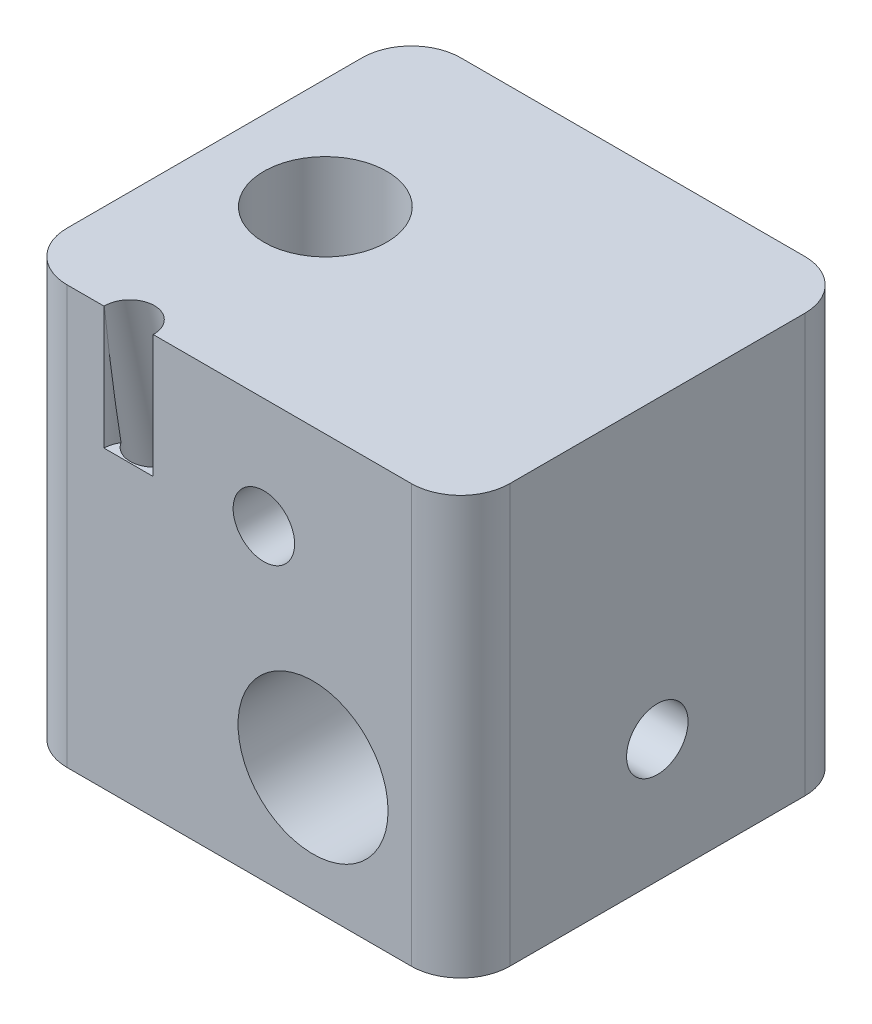
ISO-10303-21;
HEADER;
FILE_DESCRIPTION(('STEP AP214'),'2;1');
FILE_NAME('part.step','',(''),(''),'','','');
FILE_SCHEMA(('AUTOMOTIVE_DESIGN { 1 0 10303 214 1 1 1 1 }'));
ENDSEC;
DATA;
#1=APPLICATION_CONTEXT('core data for automotive mechanical design processes');
#2=APPLICATION_PROTOCOL_DEFINITION('international standard','automotive_design',2000,#1);
#3=PRODUCT_CONTEXT('',#1,'mechanical');
#4=PRODUCT('Part','Part','',(#3));
#5=PRODUCT_RELATED_PRODUCT_CATEGORY('part','',(#4));
#6=PRODUCT_DEFINITION_FORMATION('','',#4);
#7=PRODUCT_DEFINITION_CONTEXT('part definition',#1,'design');
#8=PRODUCT_DEFINITION('design','',#6,#7);
#9=PRODUCT_DEFINITION_SHAPE('','',#8);
#10=(LENGTH_UNIT() NAMED_UNIT(*) SI_UNIT(.MILLI.,.METRE.));
#11=(NAMED_UNIT(*) PLANE_ANGLE_UNIT() SI_UNIT($,.RADIAN.));
#12=(NAMED_UNIT(*) SI_UNIT($,.STERADIAN.) SOLID_ANGLE_UNIT());
#13=UNCERTAINTY_MEASURE_WITH_UNIT(LENGTH_MEASURE(1.E-05),#10,'distance_accuracy_value','');
#14=(GEOMETRIC_REPRESENTATION_CONTEXT(3) GLOBAL_UNCERTAINTY_ASSIGNED_CONTEXT((#13)) GLOBAL_UNIT_ASSIGNED_CONTEXT((#10,
#11,#12)) REPRESENTATION_CONTEXT('',''));
#15=CARTESIAN_POINT('',(0.,0.,0.));
#16=DIRECTION('',(0.,0.,1.));
#17=DIRECTION('',(1.,0.,0.));
#18=AXIS2_PLACEMENT_3D('',#15,#16,#17);
#19=CARTESIAN_POINT('',(-4.5,12.,8.));
#20=DIRECTION('',(0.,1.,0.));
#21=DIRECTION('',(0.,0.,1.));
#22=AXIS2_PLACEMENT_3D('',#19,#20,#21);
#23=CYLINDRICAL_SURFACE('',#22,1.);
#24=CARTESIAN_POINT('',(-4.5,17.,8.));
#25=DIRECTION('',(0.,1.,0.));
#26=DIRECTION('',(0.,0.,1.));
#27=AXIS2_PLACEMENT_3D('',#24,#25,#26);
#28=CIRCLE('',#27,1.);
#29=CARTESIAN_POINT('',(-3.5,17.,8.));
#30=VERTEX_POINT('',#29);
#31=CARTESIAN_POINT('',(-3.5000546384073,17.,7.98954658766438));
#32=VERTEX_POINT('',#31);
#33=EDGE_CURVE('E177',#30,#32,#28,.T.);
#34=ORIENTED_EDGE('',*,*,#33,.T.);
#35=CARTESIAN_POINT('',(-4.5,17.099457574649,8.00000000000001));
#36=DIRECTION('',(0.,0.104528463267653,-0.994521895368273));
#37=DIRECTION('',(0.,0.994521895368273,0.104528463267654));
#38=AXIS2_PLACEMENT_3D('',#35,#36,#37);
#39=ELLIPSE('',#38,9.56677223350565,1.);
#40=CARTESIAN_POINT('',(-3.65576588536236,12.,7.46402541134677));
#41=VERTEX_POINT('',#40);
#42=EDGE_CURVE('E11',#32,#41,#39,.T.);
#43=ORIENTED_EDGE('',*,*,#42,.T.);
#44=CARTESIAN_POINT('',(-4.5,12.,8.));
#45=DIRECTION('',(0.,1.,0.));
#46=DIRECTION('',(0.,0.,1.));
#47=AXIS2_PLACEMENT_3D('',#44,#45,#46);
#48=CIRCLE('',#47,1.);
#49=CARTESIAN_POINT('',(-3.5,12.,8.));
#50=VERTEX_POINT('',#49);
#51=EDGE_CURVE('E176',#50,#41,#48,.T.);
#52=ORIENTED_EDGE('',*,*,#51,.F.);
#53=DIRECTION('',(0.,1.,0.));
#54=VECTOR('',#53,1.);
#55=CARTESIAN_POINT('',(-3.5,12.,8.));
#56=LINE('',#55,#54);
#57=EDGE_CURVE('E66',#30,#50,#56,.F.);
#58=ORIENTED_EDGE('',*,*,#57,.F.);
#59=EDGE_LOOP('',(#34,#43,#52,#58));
#60=FACE_BOUND('',#59,.T.);
#61=ADVANCED_FACE('F38',(#60),#23,.F.);
#62=CARTESIAN_POINT('',(7.,0.,-6.));
#63=DIRECTION('',(0.,-1.,0.));
#64=DIRECTION('',(0.,0.,-1.));
#65=AXIS2_PLACEMENT_3D('',#62,#63,#64);
#66=PLANE('',#65);
#67=CARTESIAN_POINT('',(7.,0.,-6.));
#68=DIRECTION('',(0.,1.,0.));
#69=DIRECTION('',(0.,0.,-1.));
#70=AXIS2_PLACEMENT_3D('',#67,#68,#69);
#71=CIRCLE('',#70,2.);
#72=CARTESIAN_POINT('',(9.,0.,-5.99999999999998));
#73=VERTEX_POINT('',#72);
#74=CARTESIAN_POINT('',(6.99999999999998,0.,-8.));
#75=VERTEX_POINT('',#74);
#76=EDGE_CURVE('E203',#73,#75,#71,.T.);
#77=ORIENTED_EDGE('',*,*,#76,.F.);
#78=DIRECTION('',(0.,0.,-1.));
#79=VECTOR('',#78,1.);
#80=CARTESIAN_POINT('',(9.,0.,-5.99999999999998));
#81=LINE('',#80,#79);
#82=CARTESIAN_POINT('',(9.,0.,5.99999999999999));
#83=VERTEX_POINT('',#82);
#84=EDGE_CURVE('E210',#83,#73,#81,.T.);
#85=ORIENTED_EDGE('',*,*,#84,.F.);
#86=CARTESIAN_POINT('',(7.,0.,6.));
#87=DIRECTION('',(0.,1.,0.));
#88=DIRECTION('',(0.,0.,1.));
#89=AXIS2_PLACEMENT_3D('',#86,#87,#88);
#90=CIRCLE('',#89,2.);
#91=CARTESIAN_POINT('',(6.99999999999999,0.,8.));
#92=VERTEX_POINT('',#91);
#93=EDGE_CURVE('E239',#92,#83,#90,.T.);
#94=ORIENTED_EDGE('',*,*,#93,.F.);
#95=DIRECTION('',(1.,0.,0.));
#96=VECTOR('',#95,1.);
#97=CARTESIAN_POINT('',(-6.99999999999999,0.,8.));
#98=LINE('',#97,#96);
#99=CARTESIAN_POINT('',(-6.99999999999999,0.,8.));
#100=VERTEX_POINT('',#99);
#101=EDGE_CURVE('E237',#100,#92,#98,.T.);
#102=ORIENTED_EDGE('',*,*,#101,.F.);
#103=CARTESIAN_POINT('',(-7.,0.,6.));
#104=DIRECTION('',(0.,1.,0.));
#105=DIRECTION('',(0.,0.,1.));
#106=AXIS2_PLACEMENT_3D('',#103,#104,#105);
#107=CIRCLE('',#106,2.);
#108=CARTESIAN_POINT('',(-9.,0.,5.99999999999999));
#109=VERTEX_POINT('',#108);
#110=EDGE_CURVE('E235',#109,#100,#107,.T.);
#111=ORIENTED_EDGE('',*,*,#110,.F.);
#112=DIRECTION('',(0.,0.,1.));
#113=VECTOR('',#112,1.);
#114=CARTESIAN_POINT('',(-9.,0.,-5.99999999999998));
#115=LINE('',#114,#113);
#116=CARTESIAN_POINT('',(-9.,0.,-5.99999999999998));
#117=VERTEX_POINT('',#116);
#118=EDGE_CURVE('E233',#117,#109,#115,.T.);
#119=ORIENTED_EDGE('',*,*,#118,.F.);
#120=CARTESIAN_POINT('',(-7.,0.,-6.));
#121=DIRECTION('',(0.,1.,0.));
#122=DIRECTION('',(0.,0.,1.));
#123=AXIS2_PLACEMENT_3D('',#120,#121,#122);
#124=CIRCLE('',#123,2.);
#125=CARTESIAN_POINT('',(-6.99999999999999,0.,-8.));
#126=VERTEX_POINT('',#125);
#127=EDGE_CURVE('E231',#126,#117,#124,.T.);
#128=ORIENTED_EDGE('',*,*,#127,.F.);
#129=DIRECTION('',(-1.,0.,0.));
#130=VECTOR('',#129,1.);
#131=CARTESIAN_POINT('',(-6.99999999999999,0.,-8.));
#132=LINE('',#131,#130);
#133=EDGE_CURVE('E229',#75,#126,#132,.T.);
#134=ORIENTED_EDGE('',*,*,#133,.F.);
#135=EDGE_LOOP('',(#77,#85,#94,#102,#111,#119,#128,#134));
#136=FACE_BOUND('',#135,.T.);
#137=CARTESIAN_POINT('',(-4.5,0.,0.));
#138=DIRECTION('',(0.,1.,0.));
#139=DIRECTION('',(0.,0.,1.));
#140=AXIS2_PLACEMENT_3D('',#137,#138,#139);
#141=CIRCLE('',#140,2.5);
#142=CARTESIAN_POINT('',(-4.5,0.,2.5));
#143=VERTEX_POINT('',#142);
#144=EDGE_CURVE('E190',#143,#143,#141,.T.);
#145=ORIENTED_EDGE('',*,*,#144,.T.);
#146=EDGE_LOOP('',(#145));
#147=FACE_BOUND('',#146,.T.);
#148=ADVANCED_FACE('F151',(#136,#147),#66,.T.);
#149=CARTESIAN_POINT('',(7.,17.,-6.));
#150=DIRECTION('',(0.,-1.,0.));
#151=DIRECTION('',(0.,0.,-1.));
#152=AXIS2_PLACEMENT_3D('',#149,#150,#151);
#153=CYLINDRICAL_SURFACE('',#152,2.);
#154=ORIENTED_EDGE('',*,*,#76,.T.);
#155=DIRECTION('',(0.,-1.,0.));
#156=VECTOR('',#155,1.);
#157=CARTESIAN_POINT('',(6.99999999999998,17.,-8.));
#158=LINE('',#157,#156);
#159=CARTESIAN_POINT('',(6.99999999999998,17.,-8.));
#160=VERTEX_POINT('',#159);
#161=EDGE_CURVE('E262',#160,#75,#158,.T.);
#162=ORIENTED_EDGE('',*,*,#161,.F.);
#163=CARTESIAN_POINT('',(7.,17.,-6.));
#164=DIRECTION('',(0.,1.,0.));
#165=DIRECTION('',(0.,0.,-1.));
#166=AXIS2_PLACEMENT_3D('',#163,#164,#165);
#167=CIRCLE('',#166,2.);
#168=CARTESIAN_POINT('',(9.,17.,-5.99999999999998));
#169=VERTEX_POINT('',#168);
#170=EDGE_CURVE('E206',#169,#160,#167,.T.);
#171=ORIENTED_EDGE('',*,*,#170,.F.);
#172=DIRECTION('',(0.,-1.,0.));
#173=VECTOR('',#172,1.);
#174=CARTESIAN_POINT('',(9.,17.,-5.99999999999998));
#175=LINE('',#174,#173);
#176=EDGE_CURVE('E226',#169,#73,#175,.T.);
#177=ORIENTED_EDGE('',*,*,#176,.T.);
#178=EDGE_LOOP('',(#154,#162,#171,#177));
#179=FACE_BOUND('',#178,.T.);
#180=ADVANCED_FACE('F40',(#179),#153,.T.);
#181=CARTESIAN_POINT('',(-6.99999999999999,17.,-8.));
#182=DIRECTION('',(0.,0.,1.));
#183=DIRECTION('',(1.,0.,0.));
#184=AXIS2_PLACEMENT_3D('',#181,#182,#183);
#185=PLANE('',#184);
#186=CARTESIAN_POINT('',(0.999999999999999,12.5,-8.));
#187=DIRECTION('',(0.,0.,1.));
#188=DIRECTION('',(1.,0.,0.));
#189=AXIS2_PLACEMENT_3D('',#186,#187,#188);
#190=CIRCLE('',#189,1.25);
#191=CARTESIAN_POINT('',(2.25,12.5,-8.));
#192=VERTEX_POINT('',#191);
#193=EDGE_CURVE('E196',#192,#192,#190,.T.);
#194=ORIENTED_EDGE('',*,*,#193,.T.);
#195=EDGE_LOOP('',(#194));
#196=FACE_BOUND('',#195,.T.);
#197=CARTESIAN_POINT('',(3.,5.,-8.));
#198=DIRECTION('',(0.,0.,1.));
#199=DIRECTION('',(1.,0.,0.));
#200=AXIS2_PLACEMENT_3D('',#197,#198,#199);
#201=CIRCLE('',#200,3.05);
#202=CARTESIAN_POINT('',(6.05,5.,-8.));
#203=VERTEX_POINT('',#202);
#204=EDGE_CURVE('E200',#203,#203,#201,.T.);
#205=ORIENTED_EDGE('',*,*,#204,.T.);
#206=EDGE_LOOP('',(#205));
#207=FACE_BOUND('',#206,.T.);
#208=ORIENTED_EDGE('',*,*,#133,.T.);
#209=DIRECTION('',(0.,-1.,0.));
#210=VECTOR('',#209,1.);
#211=CARTESIAN_POINT('',(-6.99999999999999,17.,-8.));
#212=LINE('',#211,#210);
#213=CARTESIAN_POINT('',(-6.99999999999999,17.,-8.));
#214=VERTEX_POINT('',#213);
#215=EDGE_CURVE('E259',#214,#126,#212,.T.);
#216=ORIENTED_EDGE('',*,*,#215,.F.);
#217=DIRECTION('',(-1.,0.,0.));
#218=VECTOR('',#217,1.);
#219=CARTESIAN_POINT('',(-6.99999999999999,17.,-8.));
#220=LINE('',#219,#218);
#221=EDGE_CURVE('E209',#160,#214,#220,.T.);
#222=ORIENTED_EDGE('',*,*,#221,.F.);
#223=ORIENTED_EDGE('',*,*,#161,.T.);
#224=EDGE_LOOP('',(#208,#216,#222,#223));
#225=FACE_BOUND('',#224,.T.);
#226=ADVANCED_FACE('F317',(#196,#207,#225),#185,.F.);
#227=CARTESIAN_POINT('',(-7.,17.,-6.));
#228=DIRECTION('',(0.,-1.,0.));
#229=DIRECTION('',(0.,0.,-1.));
#230=AXIS2_PLACEMENT_3D('',#227,#228,#229);
#231=CYLINDRICAL_SURFACE('',#230,2.);
#232=ORIENTED_EDGE('',*,*,#127,.T.);
#233=DIRECTION('',(0.,-1.,0.));
#234=VECTOR('',#233,1.);
#235=CARTESIAN_POINT('',(-9.,17.,-5.99999999999998));
#236=LINE('',#235,#234);
#237=CARTESIAN_POINT('',(-9.,17.,-5.99999999999998));
#238=VERTEX_POINT('',#237);
#239=EDGE_CURVE('E256',#238,#117,#236,.T.);
#240=ORIENTED_EDGE('',*,*,#239,.F.);
#241=CARTESIAN_POINT('',(-7.,17.,-6.));
#242=DIRECTION('',(0.,1.,0.));
#243=DIRECTION('',(0.,0.,1.));
#244=AXIS2_PLACEMENT_3D('',#241,#242,#243);
#245=CIRCLE('',#244,2.);
#246=EDGE_CURVE('E212',#214,#238,#245,.T.);
#247=ORIENTED_EDGE('',*,*,#246,.F.);
#248=ORIENTED_EDGE('',*,*,#215,.T.);
#249=EDGE_LOOP('',(#232,#240,#247,#248));
#250=FACE_BOUND('',#249,.T.);
#251=ADVANCED_FACE('F314',(#250),#231,.T.);
#252=CARTESIAN_POINT('',(-9.,17.,-5.99999999999998));
#253=DIRECTION('',(1.,0.,0.));
#254=DIRECTION('',(0.,0.,-1.));
#255=AXIS2_PLACEMENT_3D('',#252,#253,#254);
#256=PLANE('',#255);
#257=ORIENTED_EDGE('',*,*,#118,.T.);
#258=DIRECTION('',(0.,-1.,0.));
#259=VECTOR('',#258,1.);
#260=CARTESIAN_POINT('',(-9.,17.,5.99999999999999));
#261=LINE('',#260,#259);
#262=CARTESIAN_POINT('',(-9.,17.,5.99999999999999));
#263=VERTEX_POINT('',#262);
#264=EDGE_CURVE('E253',#263,#109,#261,.T.);
#265=ORIENTED_EDGE('',*,*,#264,.F.);
#266=DIRECTION('',(0.,0.,1.));
#267=VECTOR('',#266,1.);
#268=CARTESIAN_POINT('',(-9.,17.,-5.99999999999998));
#269=LINE('',#268,#267);
#270=EDGE_CURVE('E214',#238,#263,#269,.T.);
#271=ORIENTED_EDGE('',*,*,#270,.F.);
#272=ORIENTED_EDGE('',*,*,#239,.T.);
#273=EDGE_LOOP('',(#257,#265,#271,#272));
#274=FACE_BOUND('',#273,.T.);
#275=ADVANCED_FACE('F306',(#274),#256,.F.);
#276=CARTESIAN_POINT('',(-7.,17.,6.));
#277=DIRECTION('',(0.,-1.,0.));
#278=DIRECTION('',(0.,0.,-1.));
#279=AXIS2_PLACEMENT_3D('',#276,#277,#278);
#280=CYLINDRICAL_SURFACE('',#279,2.);
#281=ORIENTED_EDGE('',*,*,#110,.T.);
#282=DIRECTION('',(0.,-1.,0.));
#283=VECTOR('',#282,1.);
#284=CARTESIAN_POINT('',(-6.99999999999999,17.,8.));
#285=LINE('',#284,#283);
#286=CARTESIAN_POINT('',(-6.99999999999999,17.,8.));
#287=VERTEX_POINT('',#286);
#288=EDGE_CURVE('E250',#287,#100,#285,.T.);
#289=ORIENTED_EDGE('',*,*,#288,.F.);
#290=CARTESIAN_POINT('',(-7.,17.,6.));
#291=DIRECTION('',(0.,1.,0.));
#292=DIRECTION('',(0.,0.,1.));
#293=AXIS2_PLACEMENT_3D('',#290,#291,#292);
#294=CIRCLE('',#293,2.);
#295=EDGE_CURVE('E216',#263,#287,#294,.T.);
#296=ORIENTED_EDGE('',*,*,#295,.F.);
#297=ORIENTED_EDGE('',*,*,#264,.T.);
#298=EDGE_LOOP('',(#281,#289,#296,#297));
#299=FACE_BOUND('',#298,.T.);
#300=ADVANCED_FACE('F296',(#299),#280,.T.);
#301=CARTESIAN_POINT('',(-6.99999999999999,17.,8.));
#302=DIRECTION('',(0.,0.,-1.));
#303=DIRECTION('',(-1.,0.,0.));
#304=AXIS2_PLACEMENT_3D('',#301,#302,#303);
#305=PLANE('',#304);
#306=CARTESIAN_POINT('',(0.999999999999999,12.5,8.00000000000001));
#307=DIRECTION('',(0.,0.,1.));
#308=DIRECTION('',(1.,0.,0.));
#309=AXIS2_PLACEMENT_3D('',#306,#307,#308);
#310=CIRCLE('',#309,1.24999999999999);
#311=CARTESIAN_POINT('',(2.24999999999999,12.5,8.00000000000001));
#312=VERTEX_POINT('',#311);
#313=EDGE_CURVE('E193',#312,#312,#310,.T.);
#314=ORIENTED_EDGE('',*,*,#313,.F.);
#315=EDGE_LOOP('',(#314));
#316=FACE_BOUND('',#315,.T.);
#317=CARTESIAN_POINT('',(3.,5.,8.));
#318=DIRECTION('',(0.,0.,1.));
#319=DIRECTION('',(1.,0.,0.));
#320=AXIS2_PLACEMENT_3D('',#317,#318,#319);
#321=CIRCLE('',#320,3.05);
#322=CARTESIAN_POINT('',(6.05,5.,8.));
#323=VERTEX_POINT('',#322);
#324=EDGE_CURVE('E199',#323,#323,#321,.T.);
#325=ORIENTED_EDGE('',*,*,#324,.F.);
#326=EDGE_LOOP('',(#325));
#327=FACE_BOUND('',#326,.T.);
#328=DIRECTION('',(1.,0.,0.));
#329=VECTOR('',#328,1.);
#330=CARTESIAN_POINT('',(-6.99999999999999,12.,8.));
#331=LINE('',#330,#329);
#332=CARTESIAN_POINT('',(-5.5,12.,8.));
#333=VERTEX_POINT('',#332);
#334=EDGE_CURVE('E265',#333,#50,#331,.T.);
#335=ORIENTED_EDGE('',*,*,#334,.F.);
#336=DIRECTION('',(0.,1.,0.));
#337=VECTOR('',#336,1.);
#338=CARTESIAN_POINT('',(-5.5,12.,8.));
#339=LINE('',#338,#337);
#340=CARTESIAN_POINT('',(-5.5,17.,8.));
#341=VERTEX_POINT('',#340);
#342=EDGE_CURVE('E173',#333,#341,#339,.T.);
#343=ORIENTED_EDGE('',*,*,#342,.T.);
#344=DIRECTION('',(1.,0.,0.));
#345=VECTOR('',#344,1.);
#346=CARTESIAN_POINT('',(-6.99999999999999,17.,8.));
#347=LINE('',#346,#345);
#348=EDGE_CURVE('E219',#287,#341,#347,.T.);
#349=ORIENTED_EDGE('',*,*,#348,.F.);
#350=ORIENTED_EDGE('',*,*,#288,.T.);
#351=ORIENTED_EDGE('',*,*,#101,.T.);
#352=DIRECTION('',(0.,-1.,0.));
#353=VECTOR('',#352,1.);
#354=CARTESIAN_POINT('',(6.99999999999999,17.,8.));
#355=LINE('',#354,#353);
#356=CARTESIAN_POINT('',(6.99999999999999,17.,8.));
#357=VERTEX_POINT('',#356);
#358=EDGE_CURVE('E247',#357,#92,#355,.T.);
#359=ORIENTED_EDGE('',*,*,#358,.F.);
#360=EDGE_CURVE('E218',#30,#357,#347,.T.);
#361=ORIENTED_EDGE('',*,*,#360,.F.);
#362=ORIENTED_EDGE('',*,*,#57,.T.);
#363=EDGE_LOOP('',(#335,#343,#349,#350,#351,#359,#361,#362));
#364=FACE_BOUND('',#363,.T.);
#365=ADVANCED_FACE('F268',(#316,#327,#364),#305,.F.);
#366=CARTESIAN_POINT('',(7.,17.,6.));
#367=DIRECTION('',(0.,-1.,0.));
#368=DIRECTION('',(0.,0.,-1.));
#369=AXIS2_PLACEMENT_3D('',#366,#367,#368);
#370=CYLINDRICAL_SURFACE('',#369,2.);
#371=ORIENTED_EDGE('',*,*,#93,.T.);
#372=DIRECTION('',(0.,-1.,0.));
#373=VECTOR('',#372,1.);
#374=CARTESIAN_POINT('',(9.,17.,5.99999999999999));
#375=LINE('',#374,#373);
#376=CARTESIAN_POINT('',(9.,17.,5.99999999999999));
#377=VERTEX_POINT('',#376);
#378=EDGE_CURVE('E244',#377,#83,#375,.T.);
#379=ORIENTED_EDGE('',*,*,#378,.F.);
#380=CARTESIAN_POINT('',(7.,17.,6.));
#381=DIRECTION('',(0.,1.,0.));
#382=DIRECTION('',(0.,0.,1.));
#383=AXIS2_PLACEMENT_3D('',#380,#381,#382);
#384=CIRCLE('',#383,2.);
#385=EDGE_CURVE('E222',#357,#377,#384,.T.);
#386=ORIENTED_EDGE('',*,*,#385,.F.);
#387=ORIENTED_EDGE('',*,*,#358,.T.);
#388=EDGE_LOOP('',(#371,#379,#386,#387));
#389=FACE_BOUND('',#388,.T.);
#390=ADVANCED_FACE('F295',(#389),#370,.T.);
#391=CARTESIAN_POINT('',(9.,17.,-5.99999999999998));
#392=DIRECTION('',(-1.,0.,0.));
#393=DIRECTION('',(0.,0.,1.));
#394=AXIS2_PLACEMENT_3D('',#391,#392,#393);
#395=PLANE('',#394);
#396=CARTESIAN_POINT('',(9.,5.,0.));
#397=DIRECTION('',(1.,0.,0.));
#398=DIRECTION('',(0.,0.,-1.));
#399=AXIS2_PLACEMENT_3D('',#396,#397,#398);
#400=CIRCLE('',#399,1.25);
#401=CARTESIAN_POINT('',(9.,5.,-1.25));
#402=VERTEX_POINT('',#401);
#403=EDGE_CURVE('E279',#402,#402,#400,.T.);
#404=ORIENTED_EDGE('',*,*,#403,.F.);
#405=EDGE_LOOP('',(#404));
#406=FACE_BOUND('',#405,.T.);
#407=ORIENTED_EDGE('',*,*,#84,.T.);
#408=ORIENTED_EDGE('',*,*,#176,.F.);
#409=DIRECTION('',(0.,0.,-1.));
#410=VECTOR('',#409,1.);
#411=CARTESIAN_POINT('',(9.,17.,-5.99999999999998));
#412=LINE('',#411,#410);
#413=EDGE_CURVE('E224',#377,#169,#412,.T.);
#414=ORIENTED_EDGE('',*,*,#413,.F.);
#415=ORIENTED_EDGE('',*,*,#378,.T.);
#416=EDGE_LOOP('',(#407,#408,#414,#415));
#417=FACE_BOUND('',#416,.T.);
#418=ADVANCED_FACE('F303',(#406,#417),#395,.F.);
#419=CARTESIAN_POINT('',(7.,17.,-6.));
#420=DIRECTION('',(0.,-1.,0.));
#421=DIRECTION('',(0.,0.,-1.));
#422=AXIS2_PLACEMENT_3D('',#419,#420,#421);
#423=PLANE('',#422);
#424=CARTESIAN_POINT('',(-4.5,17.,0.));
#425=DIRECTION('',(0.,1.,0.));
#426=DIRECTION('',(0.,0.,1.));
#427=AXIS2_PLACEMENT_3D('',#424,#425,#426);
#428=CIRCLE('',#427,2.49999999999999);
#429=CARTESIAN_POINT('',(-4.5,17.,2.49999999999999));
#430=VERTEX_POINT('',#429);
#431=EDGE_CURVE('E187',#430,#430,#428,.T.);
#432=ORIENTED_EDGE('',*,*,#431,.F.);
#433=EDGE_LOOP('',(#432));
#434=FACE_BOUND('',#433,.T.);
#435=CARTESIAN_POINT('',(-5.49994536159271,17.,7.98954658767516));
#436=VERTEX_POINT('',#435);
#437=EDGE_CURVE('E180',#436,#341,#28,.T.);
#438=ORIENTED_EDGE('',*,*,#437,.F.);
#439=CARTESIAN_POINT('',(-4.5,17.,7.9788596399006));
#440=DIRECTION('',(0.,-1.,0.));
#441=DIRECTION('',(0.,0.,-1.));
#442=AXIS2_PLACEMENT_3D('',#439,#440,#441);
#443=ELLIPSE('',#442,1.02234059486503,1.);
#444=EDGE_CURVE('E58',#436,#32,#443,.T.);
#445=ORIENTED_EDGE('',*,*,#444,.T.);
#446=ORIENTED_EDGE('',*,*,#33,.F.);
#447=ORIENTED_EDGE('',*,*,#360,.T.);
#448=ORIENTED_EDGE('',*,*,#385,.T.);
#449=ORIENTED_EDGE('',*,*,#413,.T.);
#450=ORIENTED_EDGE('',*,*,#170,.T.);
#451=ORIENTED_EDGE('',*,*,#221,.T.);
#452=ORIENTED_EDGE('',*,*,#246,.T.);
#453=ORIENTED_EDGE('',*,*,#270,.T.);
#454=ORIENTED_EDGE('',*,*,#295,.T.);
#455=ORIENTED_EDGE('',*,*,#348,.T.);
#456=EDGE_LOOP('',(#438,#445,#446,#447,#448,#449,#450,#451,#452,#453,#454,#455));
#457=FACE_BOUND('',#456,.T.);
#458=ADVANCED_FACE('F272',(#434,#457),#423,.F.);
#459=CARTESIAN_POINT('',(3.,5.,-8.));
#460=DIRECTION('',(0.,0.,1.));
#461=DIRECTION('',(1.,0.,0.));
#462=AXIS2_PLACEMENT_3D('',#459,#460,#461);
#463=CYLINDRICAL_SURFACE('',#462,3.05);
#464=CARTESIAN_POINT('',(6.05,5.,-1.25));
#465=CARTESIAN_POINT('',(6.0499949013604,5.06705105449435,-1.24999317358084));
#466=CARTESIAN_POINT('',(6.04776316601173,5.13421220939516,-1.2445728904159));
#467=CARTESIAN_POINT('',(6.03905220749816,5.26663531512961,-1.22308214272691));
#468=CARTESIAN_POINT('',(6.03256170556949,5.33189174087961,-1.2069833965083));
#469=CARTESIAN_POINT('',(6.01603149034563,5.45837429284752,-1.16482596800736));
#470=CARTESIAN_POINT('',(6.00600364451594,5.5196130929358,-1.13880056530878));
#471=CARTESIAN_POINT('',(5.98337979201622,5.63679775394015,-1.07766372514542));
#472=CARTESIAN_POINT('',(5.97078461030852,5.69274530666015,-1.04255520538644));
#473=CARTESIAN_POINT('',(5.94360272183732,5.80058268229026,-0.962433598338683));
#474=CARTESIAN_POINT('',(5.92895218720805,5.85217961883631,-0.917048137846257));
#475=CARTESIAN_POINT('',(5.8995935820288,5.94727980579278,-0.818447693953155));
#476=CARTESIAN_POINT('',(5.88488548598071,5.99077892161813,-0.765228735620994));
#477=CARTESIAN_POINT('',(5.85630174305004,6.07047635819199,-0.64942208796871));
#478=CARTESIAN_POINT('',(5.84249824263372,6.10623272255294,-0.586510586657886));
#479=CARTESIAN_POINT('',(5.81829427065234,6.16652509902148,-0.454917226841783));
#480=CARTESIAN_POINT('',(5.80789210323985,6.1910667050528,-0.386238265428793));
#481=CARTESIAN_POINT('',(5.79235707938261,6.227033698322,-0.248428842832731));
#482=CARTESIAN_POINT('',(5.78699943260883,6.23902161527503,-0.179471492843172));
#483=CARTESIAN_POINT('',(5.78151145539133,6.25129693566521,-0.0403318756690747));
#484=CARTESIAN_POINT('',(5.78137837438494,6.25159049579919,0.0298497275147819));
#485=CARTESIAN_POINT('',(5.78616368996563,6.24089353762405,0.163925901590137));
#486=CARTESIAN_POINT('',(5.79071047916049,6.23073314256809,0.227902592734092));
#487=CARTESIAN_POINT('',(5.80371701324257,6.20080567936669,0.353147282962071));
#488=CARTESIAN_POINT('',(5.81217747930137,6.18103684064336,0.41441478054353));
#489=CARTESIAN_POINT('',(5.83224715740188,6.13207159424285,0.534021432652645));
#490=CARTESIAN_POINT('',(5.84391858333761,6.10268647565431,0.592272424650275));
#491=CARTESIAN_POINT('',(5.8690795378448,6.03545581744839,0.703238106802874));
#492=CARTESIAN_POINT('',(5.88256976900066,5.9976070046597,0.755950643442822));
#493=CARTESIAN_POINT('',(5.91118669367845,5.91089979031178,0.858864937284251));
#494=CARTESIAN_POINT('',(5.92635714795841,5.86139546177047,0.908511828807874));
#495=CARTESIAN_POINT('',(5.95569448523891,5.75460843164101,0.998981661817663));
#496=CARTESIAN_POINT('',(5.96986114763167,5.69732402821036,1.03980266761885));
#497=CARTESIAN_POINT('',(5.9959821432301,5.57496342854658,1.11223980523006));
#498=CARTESIAN_POINT('',(6.00788187819974,5.50974527572703,1.14363728064276));
#499=CARTESIAN_POINT('',(6.02771185130719,5.37434088842294,1.19482196887003));
#500=CARTESIAN_POINT('',(6.0356442094366,5.30415733016857,1.21461538335976));
#501=CARTESIAN_POINT('',(6.04625363825052,5.16545720041041,1.24088500214244));
#502=CARTESIAN_POINT('',(6.04922426910946,5.09710415103709,1.24810627215568));
#503=CARTESIAN_POINT('',(6.0505074612745,4.96010441371817,1.25123907850245));
#504=CARTESIAN_POINT('',(6.04882130524732,4.89145781182913,1.24715372913384));
#505=CARTESIAN_POINT('',(6.04117156509262,4.75926209998629,1.22832878266846));
#506=CARTESIAN_POINT('',(6.03541570476584,4.69562598291882,1.21410632521057));
#507=CARTESIAN_POINT('',(6.02042451329165,4.57170816248345,1.17612394528366));
#508=CARTESIAN_POINT('',(6.01118873925112,4.51142688721188,1.15236280878941));
#509=CARTESIAN_POINT('',(5.98977295322551,4.39383011012163,1.09520071595727));
#510=CARTESIAN_POINT('',(5.97751077732146,4.33666382302296,1.06152455804877));
#511=CARTESIAN_POINT('',(5.95135965585715,4.22859041874229,0.985791883606979));
#512=CARTESIAN_POINT('',(5.93747004246777,4.17768588879936,0.943731921728038));
#513=CARTESIAN_POINT('',(5.9083776173988,4.07987991098666,0.84901559600058));
#514=CARTESIAN_POINT('',(5.89315046142814,4.03349954211682,0.795827240559546));
#515=CARTESIAN_POINT('',(5.86397295744692,3.95018452435906,0.682168042389588));
#516=CARTESIAN_POINT('',(5.85002286554325,3.91325176747518,0.621695744519813));
#517=CARTESIAN_POINT('',(5.82491824303052,3.84955272757804,0.49408064279938));
#518=CARTESIAN_POINT('',(5.8138001745101,3.82291696039833,0.426864996442403));
#519=CARTESIAN_POINT('',(5.79614362783962,3.78156002386075,0.288305958715392));
#520=CARTESIAN_POINT('',(5.78960153937764,3.7668294602223,0.216965869632516));
#521=CARTESIAN_POINT('',(5.78237686582237,3.75061997017984,0.0779442828042265));
#522=CARTESIAN_POINT('',(5.78129189039513,3.74823064874134,0.010389284598139));
#523=CARTESIAN_POINT('',(5.78404131006805,3.75435741732201,-0.124115415101153));
#524=CARTESIAN_POINT('',(5.78787500688879,3.76287195937366,-0.191065201154603));
#525=CARTESIAN_POINT('',(5.79966724973413,3.78980857539514,-0.319459584533195));
#526=CARTESIAN_POINT('',(5.80743875303861,3.80778270632241,-0.38101694579431));
#527=CARTESIAN_POINT('',(5.82609039777681,3.85269826055876,-0.500260930445375));
#528=CARTESIAN_POINT('',(5.83697140660187,3.87964218632338,-0.557946468244503));
#529=CARTESIAN_POINT('',(5.86141244323642,3.94356546820025,-0.671520528671244));
#530=CARTESIAN_POINT('',(5.87509264152987,3.9810430499474,-0.727102315583994));
#531=CARTESIAN_POINT('',(5.90324259102355,4.06425954659735,-0.831473336340558));
#532=CARTESIAN_POINT('',(5.91771260035406,4.11000117381969,-0.880260330746794));
#533=CARTESIAN_POINT('',(5.94701985281455,4.21222488066987,-0.973140820244658));
#534=CARTESIAN_POINT('',(5.961812751821,4.2692324065468,-1.01667265144534));
#535=CARTESIAN_POINT('',(5.98908126299053,4.39029737005191,-1.09357367951556));
#536=CARTESIAN_POINT('',(6.00155581115557,4.45435802331352,-1.12693821461591));
#537=CARTESIAN_POINT('',(6.02258806460315,4.58663629870452,-1.18180811191665));
#538=CARTESIAN_POINT('',(6.03121040731175,4.65476171520484,-1.20351052450805));
#539=CARTESIAN_POINT('',(6.04383134859934,4.79399616753341,-1.23495872650017));
#540=CARTESIAN_POINT('',(6.04784450441534,4.86509507070934,-1.24474216568277));
#541=CARTESIAN_POINT('',(6.04978053015449,4.95760124338892,-1.24946289651355));
#542=CARTESIAN_POINT('',(6.05000161244387,4.97879511590617,-1.25000215885385));
#543=CARTESIAN_POINT('',(6.05,5.,-1.25));
#544=B_SPLINE_CURVE_WITH_KNOTS('',3,(#464,#465,#466,#467,#468,#469,#470,#471,#472,#473,#474,
#475,#476,#477,#478,#479,#480,#481,#482,#483,#484,#485,#486,#487,#488,#489,#490,#491,#492,#493,
#494,#495,#496,#497,#498,#499,#500,#501,#502,#503,#504,#505,#506,#507,#508,#509,#510,#511,#512,
#513,#514,#515,#516,#517,#518,#519,#520,#521,#522,#523,#524,#525,#526,#527,#528,#529,#530,#531,
#532,#533,#534,#535,#536,#537,#538,#539,#540,#541,#542,#543),.UNSPECIFIED.,.T.,.F.,(4,2,2,2,2,2,
2,2,2,2,2,2,2,2,2,2,2,2,2,2,2,2,2,2,2,2,2,2,2,2,2,2,2,2,2,2,2,2,2,4),(0.,0.201094311180327,
0.402723354574275,0.603682285542811,0.804576743863709,1.01444492091329,1.22441996030868,
1.4443140997696,1.66409843594336,1.87354721803841,2.08288573073389,2.27679448285736,
2.47073898070665,2.66874390795883,2.86682554265504,3.08105274490333,3.29532688370777,
3.51424468844057,3.73304538781655,3.93837132545349,4.14364071369573,4.33912550528583,
4.53463518488673,4.73618655641971,4.93782092740472,5.15341391236425,5.36905003881044,
5.58733616568888,5.80544987646515,6.00721727204664,6.20895602688516,6.40190297186303,
6.59490379169178,6.79928960640033,7.0037426242785,7.22240178249369,7.44116104698126,
7.65609749208751,7.87035321839585,7.93394925864705),.UNSPECIFIED.);
#545=CARTESIAN_POINT('',(6.05,5.,-1.25));
#546=VERTEX_POINT('',#545);
#547=EDGE_CURVE('E42',#546,#546,#544,.T.);
#548=ORIENTED_EDGE('',*,*,#547,.T.);
#549=EDGE_LOOP('',(#548));
#550=FACE_BOUND('',#549,.T.);
#551=ORIENTED_EDGE('',*,*,#204,.F.);
#552=EDGE_LOOP('',(#551));
#553=FACE_BOUND('',#552,.T.);
#554=ORIENTED_EDGE('',*,*,#324,.T.);
#555=EDGE_LOOP('',(#554));
#556=FACE_BOUND('',#555,.T.);
#557=ADVANCED_FACE('F285',(#550,#553,#556),#463,.F.);
#558=CARTESIAN_POINT('',(0.999999999999999,12.5,8.));
#559=DIRECTION('',(0.,0.,1.));
#560=DIRECTION('',(1.,0.,0.));
#561=AXIS2_PLACEMENT_3D('',#558,#559,#560);
#562=CYLINDRICAL_SURFACE('',#561,1.24999999999999);
#563=ORIENTED_EDGE('',*,*,#193,.F.);
#564=EDGE_LOOP('',(#563));
#565=FACE_BOUND('',#564,.T.);
#566=ORIENTED_EDGE('',*,*,#313,.T.);
#567=EDGE_LOOP('',(#566));
#568=FACE_BOUND('',#567,.T.);
#569=ADVANCED_FACE('F289',(#565,#568),#562,.F.);
#570=CARTESIAN_POINT('',(-4.5,17.,0.));
#571=DIRECTION('',(0.,1.,0.));
#572=DIRECTION('',(0.,0.,1.));
#573=AXIS2_PLACEMENT_3D('',#570,#571,#572);
#574=CYLINDRICAL_SURFACE('',#573,2.49999999999999);
#575=ORIENTED_EDGE('',*,*,#144,.F.);
#576=EDGE_LOOP('',(#575));
#577=FACE_BOUND('',#576,.T.);
#578=ORIENTED_EDGE('',*,*,#431,.T.);
#579=EDGE_LOOP('',(#578));
#580=FACE_BOUND('',#579,.T.);
#581=ADVANCED_FACE('F166',(#577,#580),#574,.F.);
#582=CARTESIAN_POINT('',(-4.5,12.,8.));
#583=DIRECTION('',(0.,1.,0.));
#584=DIRECTION('',(0.,0.,1.));
#585=AXIS2_PLACEMENT_3D('',#582,#583,#584);
#586=PLANE('',#585);
#587=CARTESIAN_POINT('',(-4.5,12.,6.91607683155049));
#588=DIRECTION('',(0.,1.,0.));
#589=DIRECTION('',(0.,0.,-1.));
#590=AXIS2_PLACEMENT_3D('',#587,#588,#589);
#591=ELLIPSE('',#590,1.02234059486503,1.);
#592=CARTESIAN_POINT('',(-5.34423411463764,12.,7.46402541134677));
#593=VERTEX_POINT('',#592);
#594=EDGE_CURVE('E274',#593,#41,#591,.T.);
#595=ORIENTED_EDGE('',*,*,#594,.F.);
#596=EDGE_CURVE('E170',#593,#333,#48,.T.);
#597=ORIENTED_EDGE('',*,*,#596,.T.);
#598=ORIENTED_EDGE('',*,*,#334,.T.);
#599=ORIENTED_EDGE('',*,*,#51,.T.);
#600=EDGE_LOOP('',(#595,#597,#598,#599));
#601=FACE_BOUND('',#600,.T.);
#602=ADVANCED_FACE('F161',(#601),#586,.T.);
#603=ORIENTED_EDGE('',*,*,#596,.F.);
#604=EDGE_CURVE('E51',#593,#436,#39,.T.);
#605=ORIENTED_EDGE('',*,*,#604,.T.);
#606=ORIENTED_EDGE('',*,*,#437,.T.);
#607=ORIENTED_EDGE('',*,*,#342,.F.);
#608=EDGE_LOOP('',(#603,#605,#606,#607));
#609=FACE_BOUND('',#608,.T.);
#610=ADVANCED_FACE('F146',(#609),#23,.F.);
#611=CARTESIAN_POINT('',(-4.5,1.13265938453962,4.60615227583124));
#612=DIRECTION('',(0.,-0.978147600733806,-0.20791169081776));
#613=DIRECTION('',(0.,0.20791169081776,-0.978147600733806));
#614=AXIS2_PLACEMENT_3D('',#611,#612,#613);
#615=CYLINDRICAL_SURFACE('',#614,1.);
#616=CARTESIAN_POINT('',(-4.5,2.61791169081776,4.9218523992662));
#617=DIRECTION('',(0.,-0.978147600733806,-0.20791169081776));
#618=DIRECTION('',(0.,0.20791169081776,-0.978147600733806));
#619=AXIS2_PLACEMENT_3D('',#616,#617,#618);
#620=CIRCLE('',#619,1.);
#621=CARTESIAN_POINT('',(-4.5,2.82582338163552,3.94370479853239));
#622=VERTEX_POINT('',#621);
#623=EDGE_CURVE('E275',#622,#622,#620,.T.);
#624=ORIENTED_EDGE('',*,*,#623,.T.);
#625=EDGE_LOOP('',(#624));
#626=FACE_BOUND('',#625,.T.);
#627=ORIENTED_EDGE('',*,*,#444,.F.);
#628=ORIENTED_EDGE('',*,*,#604,.F.);
#629=ORIENTED_EDGE('',*,*,#594,.T.);
#630=ORIENTED_EDGE('',*,*,#42,.F.);
#631=EDGE_LOOP('',(#627,#628,#629,#630));
#632=FACE_BOUND('',#631,.T.);
#633=ADVANCED_FACE('F138',(#626,#632),#615,.F.);
#634=CARTESIAN_POINT('',(-4.5,2.03018131794052,4.79692645201837));
#635=DIRECTION('',(0.,0.978147600733806,0.20791169081776));
#636=DIRECTION('',(0.,-0.20791169081776,0.978147600733806));
#637=AXIS2_PLACEMENT_3D('',#634,#635,#636);
#638=CONICAL_SURFACE('',#637,0.,1.02974425867665);
#639=ORIENTED_EDGE('',*,*,#623,.F.);
#640=EDGE_LOOP('',(#639));
#641=FACE_BOUND('',#640,.T.);
#642=CARTESIAN_POINT('',(-4.5,2.03018131794052,4.79692645201837));
#643=VERTEX_POINT('',#642);
#644=VERTEX_LOOP('',#643);
#645=FACE_BOUND('',#644,.T.);
#646=ADVANCED_FACE('F135',(#641,#645),#638,.F.);
#647=CARTESIAN_POINT('',(9.,5.,0.));
#648=DIRECTION('',(1.,0.,0.));
#649=DIRECTION('',(0.,0.,-1.));
#650=AXIS2_PLACEMENT_3D('',#647,#648,#649);
#651=CYLINDRICAL_SURFACE('',#650,1.25);
#652=ORIENTED_EDGE('',*,*,#403,.T.);
#653=EDGE_LOOP('',(#652));
#654=FACE_BOUND('',#653,.T.);
#655=ORIENTED_EDGE('',*,*,#547,.F.);
#656=EDGE_LOOP('',(#655));
#657=FACE_BOUND('',#656,.T.);
#658=ADVANCED_FACE('F137',(#654,#657),#651,.F.);
#659=CLOSED_SHELL('',(#61,#148,#180,#226,#251,#275,#300,#365,#390,#418,#458,#557,#569,#581,#602,
#610,#633,#646,#658));
#660=MANIFOLD_SOLID_BREP('B2',#659);
#661=ADVANCED_BREP_SHAPE_REPRESENTATION('',(#18,#660),#14);
#662=SHAPE_DEFINITION_REPRESENTATION(#9,#661);
ENDSEC;
END-ISO-10303-21;
